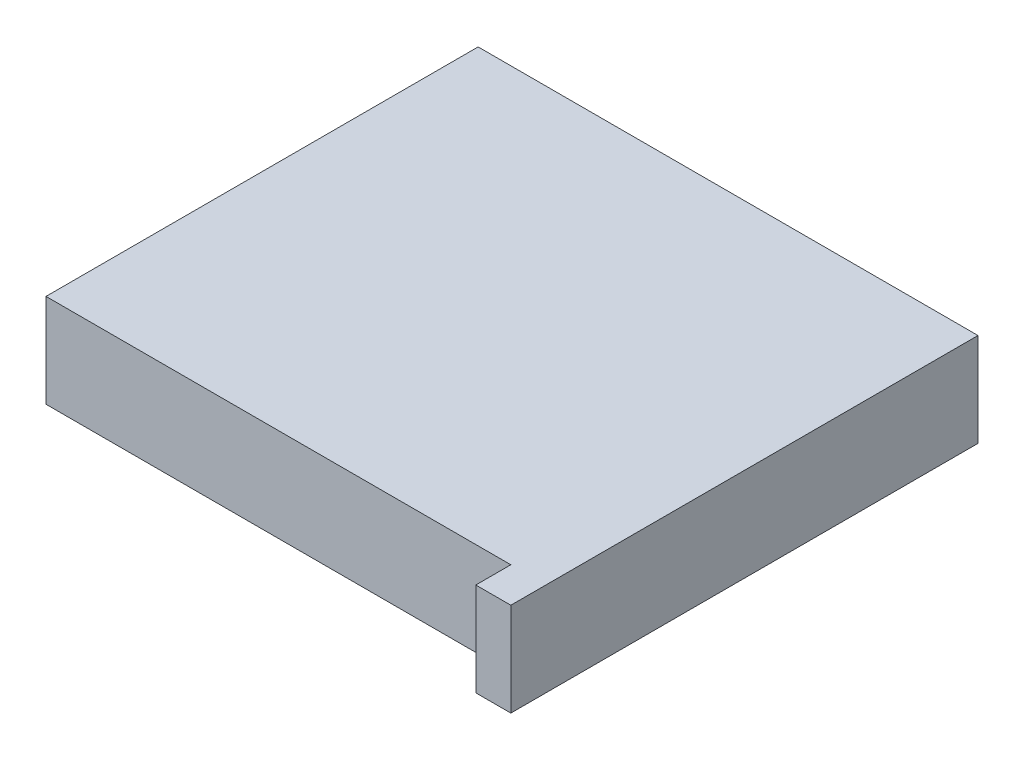
ISO-10303-21;
HEADER;
FILE_DESCRIPTION(('STEP AP214'),'2;1');
FILE_NAME('part.step','',(''),(''),'','','');
FILE_SCHEMA(('AUTOMOTIVE_DESIGN { 1 0 10303 214 1 1 1 1 }'));
ENDSEC;
DATA;
#1=APPLICATION_CONTEXT('core data for automotive mechanical design processes');
#2=APPLICATION_PROTOCOL_DEFINITION('international standard','automotive_design',2000,#1);
#3=PRODUCT_CONTEXT('',#1,'mechanical');
#4=PRODUCT('Part','Part','',(#3));
#5=PRODUCT_RELATED_PRODUCT_CATEGORY('part','',(#4));
#6=PRODUCT_DEFINITION_FORMATION('','',#4);
#7=PRODUCT_DEFINITION_CONTEXT('part definition',#1,'design');
#8=PRODUCT_DEFINITION('design','',#6,#7);
#9=PRODUCT_DEFINITION_SHAPE('','',#8);
#10=(LENGTH_UNIT() NAMED_UNIT(*) SI_UNIT(.MILLI.,.METRE.));
#11=(NAMED_UNIT(*) PLANE_ANGLE_UNIT() SI_UNIT($,.RADIAN.));
#12=(NAMED_UNIT(*) SI_UNIT($,.STERADIAN.) SOLID_ANGLE_UNIT());
#13=UNCERTAINTY_MEASURE_WITH_UNIT(LENGTH_MEASURE(1.E-05),#10,'distance_accuracy_value','');
#14=(GEOMETRIC_REPRESENTATION_CONTEXT(3) GLOBAL_UNCERTAINTY_ASSIGNED_CONTEXT((#13)) GLOBAL_UNIT_ASSIGNED_CONTEXT((#10,
#11,#12)) REPRESENTATION_CONTEXT('',''));
#15=CARTESIAN_POINT('',(0.,0.,0.));
#16=DIRECTION('',(0.,0.,1.));
#17=DIRECTION('',(1.,0.,0.));
#18=AXIS2_PLACEMENT_3D('',#15,#16,#17);
#19=CARTESIAN_POINT('',(0.,8.,0.));
#20=DIRECTION('',(1.,0.,0.));
#21=DIRECTION('',(0.,0.,-1.));
#22=AXIS2_PLACEMENT_3D('',#19,#20,#21);
#23=PLANE('',#22);
#24=DIRECTION('',(0.,0.,1.));
#25=VECTOR('',#24,1.);
#26=CARTESIAN_POINT('',(0.,0.,0.));
#27=LINE('',#26,#25);
#28=CARTESIAN_POINT('',(0.,0.,-37.));
#29=VERTEX_POINT('',#28);
#30=CARTESIAN_POINT('',(0.,0.,0.));
#31=VERTEX_POINT('',#30);
#32=EDGE_CURVE('E118',#29,#31,#27,.T.);
#33=ORIENTED_EDGE('',*,*,#32,.T.);
#34=DIRECTION('',(0.,-1.,0.));
#35=VECTOR('',#34,1.);
#36=CARTESIAN_POINT('',(0.,8.,0.));
#37=LINE('',#36,#35);
#38=CARTESIAN_POINT('',(0.,8.,0.));
#39=VERTEX_POINT('',#38);
#40=EDGE_CURVE('E11',#39,#31,#37,.T.);
#41=ORIENTED_EDGE('',*,*,#40,.F.);
#42=DIRECTION('',(0.,0.,1.));
#43=VECTOR('',#42,1.);
#44=CARTESIAN_POINT('',(0.,8.,0.));
#45=LINE('',#44,#43);
#46=CARTESIAN_POINT('',(0.,8.,-37.));
#47=VERTEX_POINT('',#46);
#48=EDGE_CURVE('E128',#47,#39,#45,.T.);
#49=ORIENTED_EDGE('',*,*,#48,.F.);
#50=DIRECTION('',(0.,-1.,0.));
#51=VECTOR('',#50,1.);
#52=CARTESIAN_POINT('',(0.,8.,-37.));
#53=LINE('',#52,#51);
#54=EDGE_CURVE('E114',#47,#29,#53,.T.);
#55=ORIENTED_EDGE('',*,*,#54,.T.);
#56=EDGE_LOOP('',(#33,#41,#49,#55));
#57=FACE_BOUND('',#56,.T.);
#58=ADVANCED_FACE('F34',(#57),#23,.F.);
#59=CARTESIAN_POINT('',(0.,8.,0.));
#60=DIRECTION('',(0.,0.,-1.));
#61=DIRECTION('',(-1.,0.,0.));
#62=AXIS2_PLACEMENT_3D('',#59,#60,#61);
#63=PLANE('',#62);
#64=DIRECTION('',(1.,0.,0.));
#65=VECTOR('',#64,1.);
#66=CARTESIAN_POINT('',(0.,0.,0.));
#67=LINE('',#66,#65);
#68=CARTESIAN_POINT('',(39.8,0.,0.));
#69=VERTEX_POINT('',#68);
#70=EDGE_CURVE('E121',#31,#69,#67,.T.);
#71=ORIENTED_EDGE('',*,*,#70,.T.);
#72=DIRECTION('',(0.,-1.,0.));
#73=VECTOR('',#72,1.);
#74=CARTESIAN_POINT('',(39.8,8.,0.));
#75=LINE('',#74,#73);
#76=CARTESIAN_POINT('',(39.8,8.,0.));
#77=VERTEX_POINT('',#76);
#78=EDGE_CURVE('E42',#77,#69,#75,.T.);
#79=ORIENTED_EDGE('',*,*,#78,.F.);
#80=DIRECTION('',(1.,0.,0.));
#81=VECTOR('',#80,1.);
#82=CARTESIAN_POINT('',(0.,8.,0.));
#83=LINE('',#82,#81);
#84=EDGE_CURVE('E86',#39,#77,#83,.T.);
#85=ORIENTED_EDGE('',*,*,#84,.F.);
#86=ORIENTED_EDGE('',*,*,#40,.T.);
#87=EDGE_LOOP('',(#71,#79,#85,#86));
#88=FACE_BOUND('',#87,.T.);
#89=ADVANCED_FACE('F152',(#88),#63,.F.);
#90=CARTESIAN_POINT('',(39.8,8.,0.));
#91=DIRECTION('',(1.,0.,0.));
#92=DIRECTION('',(0.,0.,-1.));
#93=AXIS2_PLACEMENT_3D('',#90,#91,#92);
#94=PLANE('',#93);
#95=DIRECTION('',(0.,0.,1.));
#96=VECTOR('',#95,1.);
#97=CARTESIAN_POINT('',(39.8,0.,0.));
#98=LINE('',#97,#96);
#99=CARTESIAN_POINT('',(39.8,0.,3.));
#100=VERTEX_POINT('',#99);
#101=EDGE_CURVE('E123',#69,#100,#98,.T.);
#102=ORIENTED_EDGE('',*,*,#101,.T.);
#103=DIRECTION('',(0.,-1.,0.));
#104=VECTOR('',#103,1.);
#105=CARTESIAN_POINT('',(39.8,8.,3.));
#106=LINE('',#105,#104);
#107=CARTESIAN_POINT('',(39.8,8.,3.));
#108=VERTEX_POINT('',#107);
#109=EDGE_CURVE('E109',#108,#100,#106,.T.);
#110=ORIENTED_EDGE('',*,*,#109,.F.);
#111=DIRECTION('',(0.,0.,1.));
#112=VECTOR('',#111,1.);
#113=CARTESIAN_POINT('',(39.8,8.,0.));
#114=LINE('',#113,#112);
#115=EDGE_CURVE('E99',#77,#108,#114,.T.);
#116=ORIENTED_EDGE('',*,*,#115,.F.);
#117=ORIENTED_EDGE('',*,*,#78,.T.);
#118=EDGE_LOOP('',(#102,#110,#116,#117));
#119=FACE_BOUND('',#118,.T.);
#120=ADVANCED_FACE('F134',(#119),#94,.F.);
#121=CARTESIAN_POINT('',(42.8,8.,3.));
#122=DIRECTION('',(0.,0.,-1.));
#123=DIRECTION('',(-1.,0.,0.));
#124=AXIS2_PLACEMENT_3D('',#121,#122,#123);
#125=PLANE('',#124);
#126=DIRECTION('',(1.,0.,0.));
#127=VECTOR('',#126,1.);
#128=CARTESIAN_POINT('',(42.8,0.,3.));
#129=LINE('',#128,#127);
#130=CARTESIAN_POINT('',(42.8,0.,3.));
#131=VERTEX_POINT('',#130);
#132=EDGE_CURVE('E108',#100,#131,#129,.T.);
#133=ORIENTED_EDGE('',*,*,#132,.T.);
#134=DIRECTION('',(0.,-1.,0.));
#135=VECTOR('',#134,1.);
#136=CARTESIAN_POINT('',(42.8,8.,3.));
#137=LINE('',#136,#135);
#138=CARTESIAN_POINT('',(42.8,8.,3.));
#139=VERTEX_POINT('',#138);
#140=EDGE_CURVE('E105',#139,#131,#137,.T.);
#141=ORIENTED_EDGE('',*,*,#140,.F.);
#142=DIRECTION('',(1.,0.,0.));
#143=VECTOR('',#142,1.);
#144=CARTESIAN_POINT('',(42.8,8.,3.));
#145=LINE('',#144,#143);
#146=EDGE_CURVE('E93',#108,#139,#145,.T.);
#147=ORIENTED_EDGE('',*,*,#146,.F.);
#148=ORIENTED_EDGE('',*,*,#109,.T.);
#149=EDGE_LOOP('',(#133,#141,#147,#148));
#150=FACE_BOUND('',#149,.T.);
#151=ADVANCED_FACE('F106',(#150),#125,.F.);
#152=CARTESIAN_POINT('',(42.8,8.,0.));
#153=DIRECTION('',(-1.,0.,0.));
#154=DIRECTION('',(0.,0.,1.));
#155=AXIS2_PLACEMENT_3D('',#152,#153,#154);
#156=PLANE('',#155);
#157=DIRECTION('',(0.,0.,-1.));
#158=VECTOR('',#157,1.);
#159=CARTESIAN_POINT('',(42.8,0.,0.));
#160=LINE('',#159,#158);
#161=CARTESIAN_POINT('',(42.8,0.,-37.));
#162=VERTEX_POINT('',#161);
#163=EDGE_CURVE('E72',#131,#162,#160,.T.);
#164=ORIENTED_EDGE('',*,*,#163,.T.);
#165=DIRECTION('',(0.,-1.,0.));
#166=VECTOR('',#165,1.);
#167=CARTESIAN_POINT('',(42.8,8.,-37.));
#168=LINE('',#167,#166);
#169=CARTESIAN_POINT('',(42.8,8.,-37.));
#170=VERTEX_POINT('',#169);
#171=EDGE_CURVE('E110',#170,#162,#168,.T.);
#172=ORIENTED_EDGE('',*,*,#171,.F.);
#173=DIRECTION('',(0.,0.,-1.));
#174=VECTOR('',#173,1.);
#175=CARTESIAN_POINT('',(42.8,8.,0.));
#176=LINE('',#175,#174);
#177=EDGE_CURVE('E97',#139,#170,#176,.T.);
#178=ORIENTED_EDGE('',*,*,#177,.F.);
#179=ORIENTED_EDGE('',*,*,#140,.T.);
#180=EDGE_LOOP('',(#164,#172,#178,#179));
#181=FACE_BOUND('',#180,.T.);
#182=ADVANCED_FACE('F112',(#181),#156,.F.);
#183=CARTESIAN_POINT('',(0.,8.,-37.));
#184=DIRECTION('',(0.,0.,1.));
#185=DIRECTION('',(1.,0.,0.));
#186=AXIS2_PLACEMENT_3D('',#183,#184,#185);
#187=PLANE('',#186);
#188=DIRECTION('',(-1.,0.,0.));
#189=VECTOR('',#188,1.);
#190=CARTESIAN_POINT('',(0.,0.,-37.));
#191=LINE('',#190,#189);
#192=EDGE_CURVE('E78',#162,#29,#191,.T.);
#193=ORIENTED_EDGE('',*,*,#192,.T.);
#194=ORIENTED_EDGE('',*,*,#54,.F.);
#195=DIRECTION('',(-1.,0.,0.));
#196=VECTOR('',#195,1.);
#197=CARTESIAN_POINT('',(0.,8.,-37.));
#198=LINE('',#197,#196);
#199=EDGE_CURVE('E50',#170,#47,#198,.T.);
#200=ORIENTED_EDGE('',*,*,#199,.F.);
#201=ORIENTED_EDGE('',*,*,#171,.T.);
#202=EDGE_LOOP('',(#193,#194,#200,#201));
#203=FACE_BOUND('',#202,.T.);
#204=ADVANCED_FACE('F141',(#203),#187,.F.);
#205=CARTESIAN_POINT('',(0.,8.,0.));
#206=DIRECTION('',(0.,-1.,0.));
#207=DIRECTION('',(0.,0.,-1.));
#208=AXIS2_PLACEMENT_3D('',#205,#206,#207);
#209=PLANE('',#208);
#210=ORIENTED_EDGE('',*,*,#48,.T.);
#211=ORIENTED_EDGE('',*,*,#84,.T.);
#212=ORIENTED_EDGE('',*,*,#115,.T.);
#213=ORIENTED_EDGE('',*,*,#146,.T.);
#214=ORIENTED_EDGE('',*,*,#177,.T.);
#215=ORIENTED_EDGE('',*,*,#199,.T.);
#216=EDGE_LOOP('',(#210,#211,#212,#213,#214,#215));
#217=FACE_BOUND('',#216,.T.);
#218=ADVANCED_FACE('F95',(#217),#209,.F.);
#219=CARTESIAN_POINT('',(0.,0.,0.));
#220=DIRECTION('',(0.,-1.,0.));
#221=DIRECTION('',(0.,0.,-1.));
#222=AXIS2_PLACEMENT_3D('',#219,#220,#221);
#223=PLANE('',#222);
#224=ORIENTED_EDGE('',*,*,#32,.F.);
#225=ORIENTED_EDGE('',*,*,#192,.F.);
#226=ORIENTED_EDGE('',*,*,#163,.F.);
#227=ORIENTED_EDGE('',*,*,#132,.F.);
#228=ORIENTED_EDGE('',*,*,#101,.F.);
#229=ORIENTED_EDGE('',*,*,#70,.F.);
#230=EDGE_LOOP('',(#224,#225,#226,#227,#228,#229));
#231=FACE_BOUND('',#230,.T.);
#232=ADVANCED_FACE('F137',(#231),#223,.T.);
#233=CLOSED_SHELL('',(#58,#89,#120,#151,#182,#204,#218,#232));
#234=MANIFOLD_SOLID_BREP('B2',#233);
#235=ADVANCED_BREP_SHAPE_REPRESENTATION('',(#18,#234),#14);
#236=SHAPE_DEFINITION_REPRESENTATION(#9,#235);
ENDSEC;
END-ISO-10303-21;
